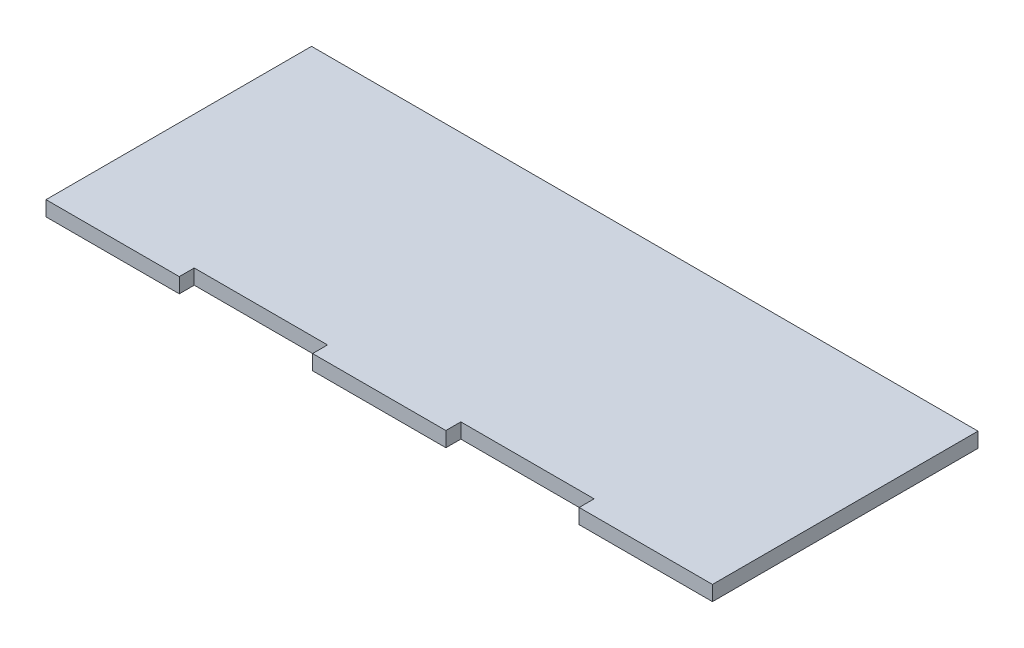
ISO-10303-21;
HEADER;
FILE_DESCRIPTION(('STEP AP214'),'2;1');
FILE_NAME('part.step','',(''),(''),'','','');
FILE_SCHEMA(('AUTOMOTIVE_DESIGN { 1 0 10303 214 1 1 1 1 }'));
ENDSEC;
DATA;
#1=APPLICATION_CONTEXT('core data for automotive mechanical design processes');
#2=APPLICATION_PROTOCOL_DEFINITION('international standard','automotive_design',2000,#1);
#3=PRODUCT_CONTEXT('',#1,'mechanical');
#4=PRODUCT('Part','Part','',(#3));
#5=PRODUCT_RELATED_PRODUCT_CATEGORY('part','',(#4));
#6=PRODUCT_DEFINITION_FORMATION('','',#4);
#7=PRODUCT_DEFINITION_CONTEXT('part definition',#1,'design');
#8=PRODUCT_DEFINITION('design','',#6,#7);
#9=PRODUCT_DEFINITION_SHAPE('','',#8);
#10=(LENGTH_UNIT() NAMED_UNIT(*) SI_UNIT(.MILLI.,.METRE.));
#11=(NAMED_UNIT(*) PLANE_ANGLE_UNIT() SI_UNIT($,.RADIAN.));
#12=(NAMED_UNIT(*) SI_UNIT($,.STERADIAN.) SOLID_ANGLE_UNIT());
#13=UNCERTAINTY_MEASURE_WITH_UNIT(LENGTH_MEASURE(1.E-05),#10,'distance_accuracy_value','');
#14=(GEOMETRIC_REPRESENTATION_CONTEXT(3) GLOBAL_UNCERTAINTY_ASSIGNED_CONTEXT((#13)) GLOBAL_UNIT_ASSIGNED_CONTEXT((#10,
#11,#12)) REPRESENTATION_CONTEXT('',''));
#15=CARTESIAN_POINT('',(0.,0.,0.));
#16=DIRECTION('',(0.,0.,1.));
#17=DIRECTION('',(1.,0.,0.));
#18=AXIS2_PLACEMENT_3D('',#15,#16,#17);
#19=CARTESIAN_POINT('',(-69.720993227991,11.43,-3.44018058690745));
#20=DIRECTION('',(0.,0.,-1.));
#21=DIRECTION('',(-1.,0.,0.));
#22=AXIS2_PLACEMENT_3D('',#19,#20,#21);
#23=PLANE('',#22);
#24=DIRECTION('',(1.,0.,0.));
#25=VECTOR('',#24,1.);
#26=CARTESIAN_POINT('',(-69.720993227991,0.,-3.44018058690745));
#27=LINE('',#26,#25);
#28=CARTESIAN_POINT('',(-69.720993227991,0.,-3.44018058690745));
#29=VERTEX_POINT('',#28);
#30=CARTESIAN_POINT('',(32.2285107720091,0.,-3.44018058690745));
#31=VERTEX_POINT('',#30);
#32=EDGE_CURVE('E195',#29,#31,#27,.T.);
#33=ORIENTED_EDGE('',*,*,#32,.T.);
#34=DIRECTION('',(0.,-1.,0.));
#35=VECTOR('',#34,1.);
#36=CARTESIAN_POINT('',(32.2285107720091,11.43,-3.44018058690745));
#37=LINE('',#36,#35);
#38=CARTESIAN_POINT('',(32.2285107720091,11.43,-3.44018058690745));
#39=VERTEX_POINT('',#38);
#40=EDGE_CURVE('E151',#39,#31,#37,.T.);
#41=ORIENTED_EDGE('',*,*,#40,.F.);
#42=DIRECTION('',(1.,0.,0.));
#43=VECTOR('',#42,1.);
#44=CARTESIAN_POINT('',(-69.720993227991,11.43,-3.44018058690745));
#45=LINE('',#44,#43);
#46=CARTESIAN_POINT('',(-69.720993227991,11.43,-3.44018058690745));
#47=VERTEX_POINT('',#46);
#48=EDGE_CURVE('E141',#47,#39,#45,.T.);
#49=ORIENTED_EDGE('',*,*,#48,.F.);
#50=DIRECTION('',(0.,-1.,0.));
#51=VECTOR('',#50,1.);
#52=CARTESIAN_POINT('',(-69.720993227991,11.43,-3.44018058690745));
#53=LINE('',#52,#51);
#54=EDGE_CURVE('E11',#47,#29,#53,.T.);
#55=ORIENTED_EDGE('',*,*,#54,.T.);
#56=EDGE_LOOP('',(#33,#41,#49,#55));
#57=FACE_BOUND('',#56,.T.);
#58=ADVANCED_FACE('F32',(#57),#23,.F.);
#59=CARTESIAN_POINT('',(338.077022772009,11.43,-3.44018058690741));
#60=VERTEX_POINT('',#59);
#61=CARTESIAN_POINT('',(440.026526772009,11.43,-3.44018058690745));
#62=VERTEX_POINT('',#61);
#63=EDGE_CURVE('E183',#60,#62,#45,.T.);
#64=ORIENTED_EDGE('',*,*,#63,.F.);
#65=DIRECTION('',(0.,-1.,0.));
#66=VECTOR('',#65,1.);
#67=CARTESIAN_POINT('',(338.077022772009,11.43,-3.44018058690741));
#68=LINE('',#67,#66);
#69=CARTESIAN_POINT('',(338.077022772009,0.,-3.44018058690741));
#70=VERTEX_POINT('',#69);
#71=EDGE_CURVE('E168',#60,#70,#68,.T.);
#72=ORIENTED_EDGE('',*,*,#71,.T.);
#73=CARTESIAN_POINT('',(440.026526772009,0.,-3.44018058690745));
#74=VERTEX_POINT('',#73);
#75=EDGE_CURVE('E194',#70,#74,#27,.T.);
#76=ORIENTED_EDGE('',*,*,#75,.T.);
#77=DIRECTION('',(0.,-1.,0.));
#78=VECTOR('',#77,1.);
#79=CARTESIAN_POINT('',(440.026526772009,11.43,-3.44018058690745));
#80=LINE('',#79,#78);
#81=EDGE_CURVE('E40',#62,#74,#80,.T.);
#82=ORIENTED_EDGE('',*,*,#81,.F.);
#83=EDGE_LOOP('',(#64,#72,#76,#82));
#84=FACE_BOUND('',#83,.T.);
#85=ADVANCED_FACE('F236',(#84),#23,.F.);
#86=CARTESIAN_POINT('',(-69.720993227991,11.43,-206.533500586907));
#87=DIRECTION('',(1.,0.,0.));
#88=DIRECTION('',(0.,0.,-1.));
#89=AXIS2_PLACEMENT_3D('',#86,#87,#88);
#90=PLANE('',#89);
#91=DIRECTION('',(0.,0.,1.));
#92=VECTOR('',#91,1.);
#93=CARTESIAN_POINT('',(-69.720993227991,0.,-206.533500586907));
#94=LINE('',#93,#92);
#95=CARTESIAN_POINT('',(-69.720993227991,0.,-206.533500586907));
#96=VERTEX_POINT('',#95);
#97=EDGE_CURVE('E153',#96,#29,#94,.T.);
#98=ORIENTED_EDGE('',*,*,#97,.T.);
#99=ORIENTED_EDGE('',*,*,#54,.F.);
#100=DIRECTION('',(0.,0.,1.));
#101=VECTOR('',#100,1.);
#102=CARTESIAN_POINT('',(-69.720993227991,11.43,-206.533500586907));
#103=LINE('',#102,#101);
#104=CARTESIAN_POINT('',(-69.720993227991,11.43,-206.533500586907));
#105=VERTEX_POINT('',#104);
#106=EDGE_CURVE('E181',#105,#47,#103,.T.);
#107=ORIENTED_EDGE('',*,*,#106,.F.);
#108=DIRECTION('',(0.,-1.,0.));
#109=VECTOR('',#108,1.);
#110=CARTESIAN_POINT('',(-69.720993227991,11.43,-206.533500586907));
#111=LINE('',#110,#109);
#112=EDGE_CURVE('E191',#105,#96,#111,.T.);
#113=ORIENTED_EDGE('',*,*,#112,.T.);
#114=EDGE_LOOP('',(#98,#99,#107,#113));
#115=FACE_BOUND('',#114,.T.);
#116=ADVANCED_FACE('F34',(#115),#90,.F.);
#117=CARTESIAN_POINT('',(134.178014772009,11.43,-3.44018058690745));
#118=VERTEX_POINT('',#117);
#119=CARTESIAN_POINT('',(236.127518772009,11.43,-3.44018058690743));
#120=VERTEX_POINT('',#119);
#121=EDGE_CURVE('E187',#118,#120,#45,.T.);
#122=ORIENTED_EDGE('',*,*,#121,.F.);
#123=DIRECTION('',(0.,-1.,0.));
#124=VECTOR('',#123,1.);
#125=CARTESIAN_POINT('',(134.178014772009,11.43,-3.44018058690745));
#126=LINE('',#125,#124);
#127=CARTESIAN_POINT('',(134.178014772009,0.,-3.44018058690745));
#128=VERTEX_POINT('',#127);
#129=EDGE_CURVE('E154',#118,#128,#126,.T.);
#130=ORIENTED_EDGE('',*,*,#129,.T.);
#131=CARTESIAN_POINT('',(236.127518772009,0.,-3.44018058690745));
#132=VERTEX_POINT('',#131);
#133=EDGE_CURVE('E199',#128,#132,#27,.T.);
#134=ORIENTED_EDGE('',*,*,#133,.T.);
#135=DIRECTION('',(0.,-1.,0.));
#136=VECTOR('',#135,1.);
#137=CARTESIAN_POINT('',(236.127518772009,11.43,-3.44018058690743));
#138=LINE('',#137,#136);
#139=EDGE_CURVE('E55',#120,#132,#138,.T.);
#140=ORIENTED_EDGE('',*,*,#139,.F.);
#141=EDGE_LOOP('',(#122,#130,#134,#140));
#142=FACE_BOUND('',#141,.T.);
#143=ADVANCED_FACE('F232',(#142),#23,.F.);
#144=CARTESIAN_POINT('',(440.026526772009,11.43,-206.533500586907));
#145=DIRECTION('',(-1.,0.,0.));
#146=DIRECTION('',(0.,0.,1.));
#147=AXIS2_PLACEMENT_3D('',#144,#145,#146);
#148=PLANE('',#147);
#149=DIRECTION('',(0.,0.,-1.));
#150=VECTOR('',#149,1.);
#151=CARTESIAN_POINT('',(440.026526772009,0.,-206.533500586907));
#152=LINE('',#151,#150);
#153=CARTESIAN_POINT('',(440.026526772009,0.,-206.533500586907));
#154=VERTEX_POINT('',#153);
#155=EDGE_CURVE('E198',#74,#154,#152,.T.);
#156=ORIENTED_EDGE('',*,*,#155,.T.);
#157=DIRECTION('',(0.,-1.,0.));
#158=VECTOR('',#157,1.);
#159=CARTESIAN_POINT('',(440.026526772009,11.43,-206.533500586907));
#160=LINE('',#159,#158);
#161=CARTESIAN_POINT('',(440.026526772009,11.43,-206.533500586907));
#162=VERTEX_POINT('',#161);
#163=EDGE_CURVE('E204',#162,#154,#160,.T.);
#164=ORIENTED_EDGE('',*,*,#163,.F.);
#165=DIRECTION('',(0.,0.,-1.));
#166=VECTOR('',#165,1.);
#167=CARTESIAN_POINT('',(440.026526772009,11.43,-206.533500586907));
#168=LINE('',#167,#166);
#169=EDGE_CURVE('E186',#62,#162,#168,.T.);
#170=ORIENTED_EDGE('',*,*,#169,.F.);
#171=ORIENTED_EDGE('',*,*,#81,.T.);
#172=EDGE_LOOP('',(#156,#164,#170,#171));
#173=FACE_BOUND('',#172,.T.);
#174=ADVANCED_FACE('F211',(#173),#148,.F.);
#175=CARTESIAN_POINT('',(-69.720993227991,11.43,-206.533500586907));
#176=DIRECTION('',(0.,0.,1.));
#177=DIRECTION('',(1.,0.,0.));
#178=AXIS2_PLACEMENT_3D('',#175,#176,#177);
#179=PLANE('',#178);
#180=DIRECTION('',(-1.,0.,0.));
#181=VECTOR('',#180,1.);
#182=CARTESIAN_POINT('',(-69.720993227991,0.,-206.533500586907));
#183=LINE('',#182,#181);
#184=EDGE_CURVE('E184',#154,#96,#183,.T.);
#185=ORIENTED_EDGE('',*,*,#184,.T.);
#186=ORIENTED_EDGE('',*,*,#112,.F.);
#187=DIRECTION('',(-1.,0.,0.));
#188=VECTOR('',#187,1.);
#189=CARTESIAN_POINT('',(-69.720993227991,11.43,-206.533500586907));
#190=LINE('',#189,#188);
#191=EDGE_CURVE('E189',#162,#105,#190,.T.);
#192=ORIENTED_EDGE('',*,*,#191,.F.);
#193=ORIENTED_EDGE('',*,*,#163,.T.);
#194=EDGE_LOOP('',(#185,#186,#192,#193));
#195=FACE_BOUND('',#194,.T.);
#196=ADVANCED_FACE('F223',(#195),#179,.F.);
#197=CARTESIAN_POINT('',(0.,11.43,0.));
#198=DIRECTION('',(0.,1.,0.));
#199=DIRECTION('',(0.,0.,1.));
#200=AXIS2_PLACEMENT_3D('',#197,#198,#199);
#201=PLANE('',#200);
#202=DIRECTION('',(0.,0.,-1.));
#203=VECTOR('',#202,1.);
#204=CARTESIAN_POINT('',(32.2285107720091,11.43,-3.44018058690745));
#205=LINE('',#204,#203);
#206=CARTESIAN_POINT('',(32.228510772009,11.43,-14.8701805869074));
#207=VERTEX_POINT('',#206);
#208=EDGE_CURVE('E123',#39,#207,#205,.T.);
#209=ORIENTED_EDGE('',*,*,#208,.T.);
#210=DIRECTION('',(1.,0.,0.));
#211=VECTOR('',#210,1.);
#212=CARTESIAN_POINT('',(32.228510772009,11.43,-14.8701805869074));
#213=LINE('',#212,#211);
#214=CARTESIAN_POINT('',(134.178014772009,11.43,-14.8701805869074));
#215=VERTEX_POINT('',#214);
#216=EDGE_CURVE('E132',#207,#215,#213,.T.);
#217=ORIENTED_EDGE('',*,*,#216,.T.);
#218=DIRECTION('',(0.,0.,1.));
#219=VECTOR('',#218,1.);
#220=CARTESIAN_POINT('',(134.178014772009,11.43,-3.44018058690745));
#221=LINE('',#220,#219);
#222=EDGE_CURVE('E129',#215,#118,#221,.T.);
#223=ORIENTED_EDGE('',*,*,#222,.T.);
#224=ORIENTED_EDGE('',*,*,#121,.T.);
#225=DIRECTION('',(0.,0.,-1.));
#226=VECTOR('',#225,1.);
#227=CARTESIAN_POINT('',(236.127518772009,11.43,-3.44018058690743));
#228=LINE('',#227,#226);
#229=CARTESIAN_POINT('',(236.127518772009,11.43,-14.8701805869074));
#230=VERTEX_POINT('',#229);
#231=EDGE_CURVE('E161',#120,#230,#228,.T.);
#232=ORIENTED_EDGE('',*,*,#231,.T.);
#233=DIRECTION('',(1.,0.,0.));
#234=VECTOR('',#233,1.);
#235=CARTESIAN_POINT('',(338.077022772009,11.43,-14.8701805869074));
#236=LINE('',#235,#234);
#237=CARTESIAN_POINT('',(338.077022772009,11.43,-14.8701805869074));
#238=VERTEX_POINT('',#237);
#239=EDGE_CURVE('E165',#230,#238,#236,.T.);
#240=ORIENTED_EDGE('',*,*,#239,.T.);
#241=DIRECTION('',(0.,0.,1.));
#242=VECTOR('',#241,1.);
#243=CARTESIAN_POINT('',(338.077022772009,11.43,-3.44018058690741));
#244=LINE('',#243,#242);
#245=EDGE_CURVE('E158',#238,#60,#244,.T.);
#246=ORIENTED_EDGE('',*,*,#245,.T.);
#247=ORIENTED_EDGE('',*,*,#63,.T.);
#248=ORIENTED_EDGE('',*,*,#169,.T.);
#249=ORIENTED_EDGE('',*,*,#191,.T.);
#250=ORIENTED_EDGE('',*,*,#106,.T.);
#251=ORIENTED_EDGE('',*,*,#48,.T.);
#252=EDGE_LOOP('',(#209,#217,#223,#224,#232,#240,#246,#247,#248,#249,#250,#251));
#253=FACE_BOUND('',#252,.T.);
#254=ADVANCED_FACE('F139',(#253),#201,.T.);
#255=CARTESIAN_POINT('',(0.,0.,0.));
#256=DIRECTION('',(0.,1.,0.));
#257=DIRECTION('',(0.,0.,1.));
#258=AXIS2_PLACEMENT_3D('',#255,#256,#257);
#259=PLANE('',#258);
#260=DIRECTION('',(1.,0.,0.));
#261=VECTOR('',#260,1.);
#262=CARTESIAN_POINT('',(32.228510772009,0.,-14.8701805869074));
#263=LINE('',#262,#261);
#264=CARTESIAN_POINT('',(32.228510772009,0.,-14.8701805869074));
#265=VERTEX_POINT('',#264);
#266=CARTESIAN_POINT('',(134.178014772009,0.,-14.8701805869074));
#267=VERTEX_POINT('',#266);
#268=EDGE_CURVE('E144',#265,#267,#263,.T.);
#269=ORIENTED_EDGE('',*,*,#268,.F.);
#270=DIRECTION('',(0.,0.,-1.));
#271=VECTOR('',#270,1.);
#272=CARTESIAN_POINT('',(32.2285107720091,0.,-3.44018058690745));
#273=LINE('',#272,#271);
#274=EDGE_CURVE('E47',#31,#265,#273,.T.);
#275=ORIENTED_EDGE('',*,*,#274,.F.);
#276=ORIENTED_EDGE('',*,*,#32,.F.);
#277=ORIENTED_EDGE('',*,*,#97,.F.);
#278=ORIENTED_EDGE('',*,*,#184,.F.);
#279=ORIENTED_EDGE('',*,*,#155,.F.);
#280=ORIENTED_EDGE('',*,*,#75,.F.);
#281=DIRECTION('',(0.,0.,1.));
#282=VECTOR('',#281,1.);
#283=CARTESIAN_POINT('',(338.077022772009,0.,-3.44018058690741));
#284=LINE('',#283,#282);
#285=CARTESIAN_POINT('',(338.077022772009,0.,-14.8701805869074));
#286=VERTEX_POINT('',#285);
#287=EDGE_CURVE('E169',#286,#70,#284,.T.);
#288=ORIENTED_EDGE('',*,*,#287,.F.);
#289=DIRECTION('',(1.,0.,0.));
#290=VECTOR('',#289,1.);
#291=CARTESIAN_POINT('',(338.077022772009,0.,-14.8701805869074));
#292=LINE('',#291,#290);
#293=CARTESIAN_POINT('',(236.127518772009,0.,-14.8701805869074));
#294=VERTEX_POINT('',#293);
#295=EDGE_CURVE('E162',#294,#286,#292,.T.);
#296=ORIENTED_EDGE('',*,*,#295,.F.);
#297=DIRECTION('',(0.,0.,-1.));
#298=VECTOR('',#297,1.);
#299=CARTESIAN_POINT('',(236.127518772009,0.,-3.44018058690743));
#300=LINE('',#299,#298);
#301=EDGE_CURVE('E171',#132,#294,#300,.T.);
#302=ORIENTED_EDGE('',*,*,#301,.F.);
#303=ORIENTED_EDGE('',*,*,#133,.F.);
#304=DIRECTION('',(0.,0.,1.));
#305=VECTOR('',#304,1.);
#306=CARTESIAN_POINT('',(134.178014772009,0.,-3.44018058690745));
#307=LINE('',#306,#305);
#308=EDGE_CURVE('E142',#267,#128,#307,.T.);
#309=ORIENTED_EDGE('',*,*,#308,.F.);
#310=EDGE_LOOP('',(#269,#275,#276,#277,#278,#279,#280,#288,#296,#302,#303,#309));
#311=FACE_BOUND('',#310,.T.);
#312=ADVANCED_FACE('F218',(#311),#259,.F.);
#313=CARTESIAN_POINT('',(338.077022772009,11.43,-3.44018058690741));
#314=DIRECTION('',(1.,0.,0.));
#315=DIRECTION('',(0.,0.,-1.));
#316=AXIS2_PLACEMENT_3D('',#313,#314,#315);
#317=PLANE('',#316);
#318=ORIENTED_EDGE('',*,*,#287,.T.);
#319=ORIENTED_EDGE('',*,*,#71,.F.);
#320=ORIENTED_EDGE('',*,*,#245,.F.);
#321=DIRECTION('',(0.,-1.,0.));
#322=VECTOR('',#321,1.);
#323=CARTESIAN_POINT('',(338.077022772009,11.43,-14.8701805869074));
#324=LINE('',#323,#322);
#325=EDGE_CURVE('E149',#238,#286,#324,.T.);
#326=ORIENTED_EDGE('',*,*,#325,.T.);
#327=EDGE_LOOP('',(#318,#319,#320,#326));
#328=FACE_BOUND('',#327,.T.);
#329=ADVANCED_FACE('F238',(#328),#317,.F.);
#330=CARTESIAN_POINT('',(338.077022772009,11.43,-14.8701805869074));
#331=DIRECTION('',(0.,0.,-1.));
#332=DIRECTION('',(-1.,0.,0.));
#333=AXIS2_PLACEMENT_3D('',#330,#331,#332);
#334=PLANE('',#333);
#335=ORIENTED_EDGE('',*,*,#295,.T.);
#336=ORIENTED_EDGE('',*,*,#325,.F.);
#337=ORIENTED_EDGE('',*,*,#239,.F.);
#338=DIRECTION('',(0.,-1.,0.));
#339=VECTOR('',#338,1.);
#340=CARTESIAN_POINT('',(236.127518772009,11.43,-14.8701805869074));
#341=LINE('',#340,#339);
#342=EDGE_CURVE('E176',#230,#294,#341,.T.);
#343=ORIENTED_EDGE('',*,*,#342,.T.);
#344=EDGE_LOOP('',(#335,#336,#337,#343));
#345=FACE_BOUND('',#344,.T.);
#346=ADVANCED_FACE('F241',(#345),#334,.F.);
#347=CARTESIAN_POINT('',(236.127518772009,11.43,-3.44018058690743));
#348=DIRECTION('',(-1.,0.,0.));
#349=DIRECTION('',(0.,0.,1.));
#350=AXIS2_PLACEMENT_3D('',#347,#348,#349);
#351=PLANE('',#350);
#352=ORIENTED_EDGE('',*,*,#301,.T.);
#353=ORIENTED_EDGE('',*,*,#342,.F.);
#354=ORIENTED_EDGE('',*,*,#231,.F.);
#355=ORIENTED_EDGE('',*,*,#139,.T.);
#356=EDGE_LOOP('',(#352,#353,#354,#355));
#357=FACE_BOUND('',#356,.T.);
#358=ADVANCED_FACE('F243',(#357),#351,.F.);
#359=CARTESIAN_POINT('',(32.2285107720091,11.43,-3.44018058690745));
#360=DIRECTION('',(-1.,0.,0.));
#361=DIRECTION('',(0.,0.,1.));
#362=AXIS2_PLACEMENT_3D('',#359,#360,#361);
#363=PLANE('',#362);
#364=ORIENTED_EDGE('',*,*,#274,.T.);
#365=DIRECTION('',(0.,-1.,0.));
#366=VECTOR('',#365,1.);
#367=CARTESIAN_POINT('',(32.228510772009,11.43,-14.8701805869074));
#368=LINE('',#367,#366);
#369=EDGE_CURVE('E119',#207,#265,#368,.T.);
#370=ORIENTED_EDGE('',*,*,#369,.F.);
#371=ORIENTED_EDGE('',*,*,#208,.F.);
#372=ORIENTED_EDGE('',*,*,#40,.T.);
#373=EDGE_LOOP('',(#364,#370,#371,#372));
#374=FACE_BOUND('',#373,.T.);
#375=ADVANCED_FACE('F121',(#374),#363,.F.);
#376=CARTESIAN_POINT('',(134.178014772009,11.43,-3.44018058690745));
#377=DIRECTION('',(1.,0.,0.));
#378=DIRECTION('',(0.,0.,-1.));
#379=AXIS2_PLACEMENT_3D('',#376,#377,#378);
#380=PLANE('',#379);
#381=ORIENTED_EDGE('',*,*,#308,.T.);
#382=ORIENTED_EDGE('',*,*,#129,.F.);
#383=ORIENTED_EDGE('',*,*,#222,.F.);
#384=DIRECTION('',(0.,-1.,0.));
#385=VECTOR('',#384,1.);
#386=CARTESIAN_POINT('',(134.178014772009,11.43,-14.8701805869074));
#387=LINE('',#386,#385);
#388=EDGE_CURVE('E128',#215,#267,#387,.T.);
#389=ORIENTED_EDGE('',*,*,#388,.T.);
#390=EDGE_LOOP('',(#381,#382,#383,#389));
#391=FACE_BOUND('',#390,.T.);
#392=ADVANCED_FACE('F250',(#391),#380,.F.);
#393=CARTESIAN_POINT('',(32.228510772009,11.43,-14.8701805869074));
#394=DIRECTION('',(0.,0.,-1.));
#395=DIRECTION('',(-1.,0.,0.));
#396=AXIS2_PLACEMENT_3D('',#393,#394,#395);
#397=PLANE('',#396);
#398=ORIENTED_EDGE('',*,*,#268,.T.);
#399=ORIENTED_EDGE('',*,*,#388,.F.);
#400=ORIENTED_EDGE('',*,*,#216,.F.);
#401=ORIENTED_EDGE('',*,*,#369,.T.);
#402=EDGE_LOOP('',(#398,#399,#400,#401));
#403=FACE_BOUND('',#402,.T.);
#404=ADVANCED_FACE('F133',(#403),#397,.F.);
#405=CLOSED_SHELL('',(#58,#85,#116,#143,#174,#196,#254,#312,#329,#346,#358,#375,#392,#404));
#406=MANIFOLD_SOLID_BREP('B2',#405);
#407=ADVANCED_BREP_SHAPE_REPRESENTATION('',(#18,#406),#14);
#408=SHAPE_DEFINITION_REPRESENTATION(#9,#407);
ENDSEC;
END-ISO-10303-21;
